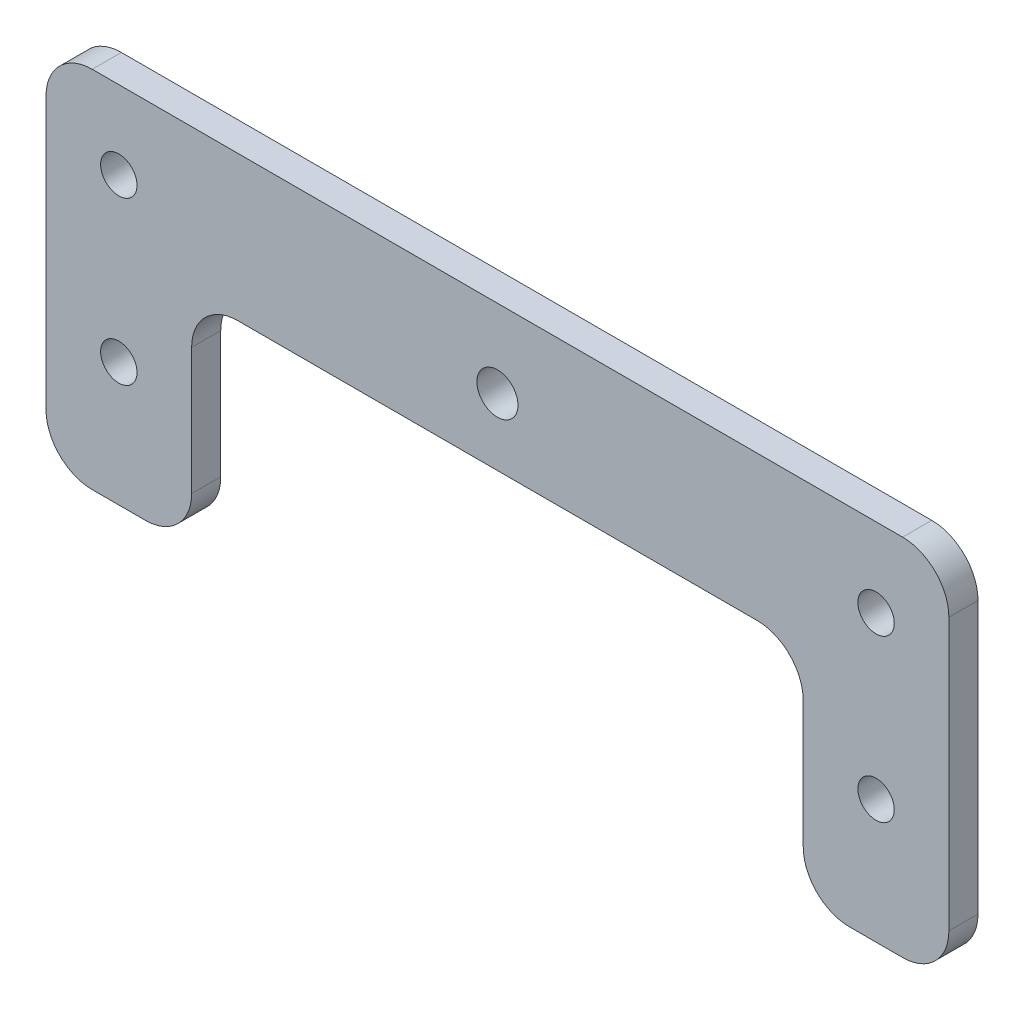
ISO-10303-21;
HEADER;
FILE_DESCRIPTION(('STEP AP214'),'2;1');
FILE_NAME('part.step','',(''),(''),'','','');
FILE_SCHEMA(('AUTOMOTIVE_DESIGN { 1 0 10303 214 1 1 1 1 }'));
ENDSEC;
DATA;
#1=APPLICATION_CONTEXT('core data for automotive mechanical design processes');
#2=APPLICATION_PROTOCOL_DEFINITION('international standard','automotive_design',2000,#1);
#3=PRODUCT_CONTEXT('',#1,'mechanical');
#4=PRODUCT('Part','Part','',(#3));
#5=PRODUCT_RELATED_PRODUCT_CATEGORY('part','',(#4));
#6=PRODUCT_DEFINITION_FORMATION('','',#4);
#7=PRODUCT_DEFINITION_CONTEXT('part definition',#1,'design');
#8=PRODUCT_DEFINITION('design','',#6,#7);
#9=PRODUCT_DEFINITION_SHAPE('','',#8);
#10=(LENGTH_UNIT() NAMED_UNIT(*) SI_UNIT(.MILLI.,.METRE.));
#11=(NAMED_UNIT(*) PLANE_ANGLE_UNIT() SI_UNIT($,.RADIAN.));
#12=(NAMED_UNIT(*) SI_UNIT($,.STERADIAN.) SOLID_ANGLE_UNIT());
#13=UNCERTAINTY_MEASURE_WITH_UNIT(LENGTH_MEASURE(1.E-05),#10,'distance_accuracy_value','');
#14=(GEOMETRIC_REPRESENTATION_CONTEXT(3) GLOBAL_UNCERTAINTY_ASSIGNED_CONTEXT((#13)) GLOBAL_UNIT_ASSIGNED_CONTEXT((#10,
#11,#12)) REPRESENTATION_CONTEXT('',''));
#15=CARTESIAN_POINT('',(0.,0.,0.));
#16=DIRECTION('',(0.,0.,1.));
#17=DIRECTION('',(1.,0.,0.));
#18=AXIS2_PLACEMENT_3D('',#15,#16,#17);
#19=CARTESIAN_POINT('',(0.,26.6043563241678,4.));
#20=DIRECTION('',(0.,1.,0.));
#21=DIRECTION('',(-1.,0.,0.));
#22=AXIS2_PLACEMENT_3D('',#19,#20,#21);
#23=PLANE('',#22);
#24=DIRECTION('',(1.,0.,0.));
#25=VECTOR('',#24,1.);
#26=CARTESIAN_POINT('',(0.,26.6043563241678,0.));
#27=LINE('',#26,#25);
#28=CARTESIAN_POINT('',(6.53805092256945,26.6043563241678,0.));
#29=VERTEX_POINT('',#28);
#30=CARTESIAN_POINT('',(117.838050922569,26.6043563241678,0.));
#31=VERTEX_POINT('',#30);
#32=EDGE_CURVE('E200',#29,#31,#27,.T.);
#33=ORIENTED_EDGE('',*,*,#32,.F.);
#34=DIRECTION('',(0.,0.,-1.));
#35=VECTOR('',#34,1.);
#36=CARTESIAN_POINT('',(6.53805092256945,26.6043563241678,4.));
#37=LINE('',#36,#35);
#38=CARTESIAN_POINT('',(6.53805092256945,26.6043563241678,4.));
#39=VERTEX_POINT('',#38);
#40=EDGE_CURVE('E11',#39,#29,#37,.T.);
#41=ORIENTED_EDGE('',*,*,#40,.F.);
#42=DIRECTION('',(1.,0.,0.));
#43=VECTOR('',#42,1.);
#44=CARTESIAN_POINT('',(0.,26.6043563241678,4.));
#45=LINE('',#44,#43);
#46=CARTESIAN_POINT('',(117.838050922569,26.6043563241678,4.));
#47=VERTEX_POINT('',#46);
#48=EDGE_CURVE('E300',#39,#47,#45,.T.);
#49=ORIENTED_EDGE('',*,*,#48,.T.);
#50=DIRECTION('',(0.,0.,-1.));
#51=VECTOR('',#50,1.);
#52=CARTESIAN_POINT('',(117.838050922569,26.6043563241678,4.));
#53=LINE('',#52,#51);
#54=EDGE_CURVE('E116',#47,#31,#53,.T.);
#55=ORIENTED_EDGE('',*,*,#54,.T.);
#56=EDGE_LOOP('',(#33,#41,#49,#55));
#57=FACE_BOUND('',#56,.T.);
#58=ADVANCED_FACE('F41',(#57),#23,.T.);
#59=CARTESIAN_POINT('',(6.53805092256941,20.2543563241678,4.));
#60=DIRECTION('',(0.,0.,-1.));
#61=DIRECTION('',(-1.,0.,0.));
#62=AXIS2_PLACEMENT_3D('',#59,#60,#61);
#63=CYLINDRICAL_SURFACE('',#62,6.35);
#64=CARTESIAN_POINT('',(6.53805092256941,20.2543563241678,0.));
#65=DIRECTION('',(0.,0.,1.));
#66=DIRECTION('',(1.,0.,0.));
#67=AXIS2_PLACEMENT_3D('',#64,#65,#66);
#68=CIRCLE('',#67,6.35);
#69=CARTESIAN_POINT('',(0.188050922569407,20.2543563241677,0.));
#70=VERTEX_POINT('',#69);
#71=EDGE_CURVE('E203',#29,#70,#68,.T.);
#72=ORIENTED_EDGE('',*,*,#71,.T.);
#73=DIRECTION('',(0.,0.,-1.));
#74=VECTOR('',#73,1.);
#75=CARTESIAN_POINT('',(0.188050922569407,20.2543563241677,4.));
#76=LINE('',#75,#74);
#77=CARTESIAN_POINT('',(0.188050922569407,20.2543563241677,4.));
#78=VERTEX_POINT('',#77);
#79=EDGE_CURVE('E50',#78,#70,#76,.T.);
#80=ORIENTED_EDGE('',*,*,#79,.F.);
#81=CARTESIAN_POINT('',(6.53805092256941,20.2543563241678,4.));
#82=DIRECTION('',(0.,0.,1.));
#83=DIRECTION('',(1.,0.,0.));
#84=AXIS2_PLACEMENT_3D('',#81,#82,#83);
#85=CIRCLE('',#84,6.35);
#86=EDGE_CURVE('E296',#39,#78,#85,.T.);
#87=ORIENTED_EDGE('',*,*,#86,.F.);
#88=ORIENTED_EDGE('',*,*,#40,.T.);
#89=EDGE_LOOP('',(#72,#80,#87,#88));
#90=FACE_BOUND('',#89,.T.);
#91=ADVANCED_FACE('F283',(#90),#63,.T.);
#92=CARTESIAN_POINT('',(0.188050922569409,0.,4.));
#93=DIRECTION('',(-1.,0.,0.));
#94=DIRECTION('',(0.,-1.,0.));
#95=AXIS2_PLACEMENT_3D('',#92,#93,#94);
#96=PLANE('',#95);
#97=DIRECTION('',(0.,1.,0.));
#98=VECTOR('',#97,1.);
#99=CARTESIAN_POINT('',(0.188050922569409,0.,0.));
#100=LINE('',#99,#98);
#101=CARTESIAN_POINT('',(0.188050922569411,-17.0456436758322,0.));
#102=VERTEX_POINT('',#101);
#103=EDGE_CURVE('E206',#102,#70,#100,.T.);
#104=ORIENTED_EDGE('',*,*,#103,.F.);
#105=DIRECTION('',(0.,0.,-1.));
#106=VECTOR('',#105,1.);
#107=CARTESIAN_POINT('',(0.188050922569411,-17.0456436758322,4.));
#108=LINE('',#107,#106);
#109=CARTESIAN_POINT('',(0.188050922569411,-17.0456436758322,4.));
#110=VERTEX_POINT('',#109);
#111=EDGE_CURVE('E273',#110,#102,#108,.T.);
#112=ORIENTED_EDGE('',*,*,#111,.F.);
#113=DIRECTION('',(0.,1.,0.));
#114=VECTOR('',#113,1.);
#115=CARTESIAN_POINT('',(0.188050922569409,0.,4.));
#116=LINE('',#115,#114);
#117=EDGE_CURVE('E280',#110,#78,#116,.T.);
#118=ORIENTED_EDGE('',*,*,#117,.T.);
#119=ORIENTED_EDGE('',*,*,#79,.T.);
#120=EDGE_LOOP('',(#104,#112,#118,#119));
#121=FACE_BOUND('',#120,.T.);
#122=ADVANCED_FACE('F278',(#121),#96,.T.);
#123=CARTESIAN_POINT('',(6.53805092256941,-17.0456436758322,4.));
#124=DIRECTION('',(0.,0.,-1.));
#125=DIRECTION('',(-1.,0.,0.));
#126=AXIS2_PLACEMENT_3D('',#123,#124,#125);
#127=CYLINDRICAL_SURFACE('',#126,6.35);
#128=CARTESIAN_POINT('',(6.53805092256941,-17.0456436758322,0.));
#129=DIRECTION('',(0.,0.,1.));
#130=DIRECTION('',(1.,0.,0.));
#131=AXIS2_PLACEMENT_3D('',#128,#129,#130);
#132=CIRCLE('',#131,6.35);
#133=CARTESIAN_POINT('',(6.53805092256945,-23.3956436758322,0.));
#134=VERTEX_POINT('',#133);
#135=EDGE_CURVE('E209',#134,#102,#132,.F.);
#136=ORIENTED_EDGE('',*,*,#135,.F.);
#137=DIRECTION('',(0.,0.,-1.));
#138=VECTOR('',#137,1.);
#139=CARTESIAN_POINT('',(6.53805092256945,-23.3956436758322,4.));
#140=LINE('',#139,#138);
#141=CARTESIAN_POINT('',(6.53805092256945,-23.3956436758322,4.));
#142=VERTEX_POINT('',#141);
#143=EDGE_CURVE('E271',#142,#134,#140,.T.);
#144=ORIENTED_EDGE('',*,*,#143,.F.);
#145=CARTESIAN_POINT('',(6.53805092256941,-17.0456436758322,4.));
#146=DIRECTION('',(0.,0.,1.));
#147=DIRECTION('',(1.,0.,0.));
#148=AXIS2_PLACEMENT_3D('',#145,#146,#147);
#149=CIRCLE('',#148,6.35);
#150=EDGE_CURVE('E294',#142,#110,#149,.F.);
#151=ORIENTED_EDGE('',*,*,#150,.T.);
#152=ORIENTED_EDGE('',*,*,#111,.T.);
#153=EDGE_LOOP('',(#136,#144,#151,#152));
#154=FACE_BOUND('',#153,.T.);
#155=ADVANCED_FACE('F290',(#154),#127,.T.);
#156=CARTESIAN_POINT('',(0.,-23.3956436758322,4.));
#157=DIRECTION('',(0.,1.,0.));
#158=DIRECTION('',(-1.,0.,0.));
#159=AXIS2_PLACEMENT_3D('',#156,#157,#158);
#160=PLANE('',#159);
#161=DIRECTION('',(1.,0.,0.));
#162=VECTOR('',#161,1.);
#163=CARTESIAN_POINT('',(0.,-23.3956436758322,0.));
#164=LINE('',#163,#162);
#165=CARTESIAN_POINT('',(13.8380509225694,-23.3956436758322,0.));
#166=VERTEX_POINT('',#165);
#167=EDGE_CURVE('E212',#134,#166,#164,.T.);
#168=ORIENTED_EDGE('',*,*,#167,.T.);
#169=DIRECTION('',(0.,0.,-1.));
#170=VECTOR('',#169,1.);
#171=CARTESIAN_POINT('',(13.8380509225694,-23.3956436758322,4.));
#172=LINE('',#171,#170);
#173=CARTESIAN_POINT('',(13.8380509225694,-23.3956436758322,4.));
#174=VERTEX_POINT('',#173);
#175=EDGE_CURVE('E268',#174,#166,#172,.T.);
#176=ORIENTED_EDGE('',*,*,#175,.F.);
#177=DIRECTION('',(1.,0.,0.));
#178=VECTOR('',#177,1.);
#179=CARTESIAN_POINT('',(0.,-23.3956436758322,4.));
#180=LINE('',#179,#178);
#181=EDGE_CURVE('E298',#142,#174,#180,.T.);
#182=ORIENTED_EDGE('',*,*,#181,.F.);
#183=ORIENTED_EDGE('',*,*,#143,.T.);
#184=EDGE_LOOP('',(#168,#176,#182,#183));
#185=FACE_BOUND('',#184,.T.);
#186=ADVANCED_FACE('F422',(#185),#160,.F.);
#187=CARTESIAN_POINT('',(13.8380509225694,-17.0456436758322,4.));
#188=DIRECTION('',(0.,0.,-1.));
#189=DIRECTION('',(-1.,0.,0.));
#190=AXIS2_PLACEMENT_3D('',#187,#188,#189);
#191=CYLINDRICAL_SURFACE('',#190,6.35);
#192=CARTESIAN_POINT('',(13.8380509225694,-17.0456436758322,0.));
#193=DIRECTION('',(0.,0.,1.));
#194=DIRECTION('',(1.,0.,0.));
#195=AXIS2_PLACEMENT_3D('',#192,#193,#194);
#196=CIRCLE('',#195,6.35);
#197=CARTESIAN_POINT('',(20.1880509225694,-17.0456436758322,0.));
#198=VERTEX_POINT('',#197);
#199=EDGE_CURVE('E215',#166,#198,#196,.T.);
#200=ORIENTED_EDGE('',*,*,#199,.T.);
#201=DIRECTION('',(0.,0.,-1.));
#202=VECTOR('',#201,1.);
#203=CARTESIAN_POINT('',(20.1880509225694,-17.0456436758322,4.));
#204=LINE('',#203,#202);
#205=CARTESIAN_POINT('',(20.1880509225694,-17.0456436758322,4.));
#206=VERTEX_POINT('',#205);
#207=EDGE_CURVE('E266',#206,#198,#204,.T.);
#208=ORIENTED_EDGE('',*,*,#207,.F.);
#209=CARTESIAN_POINT('',(13.8380509225694,-17.0456436758322,4.));
#210=DIRECTION('',(0.,0.,1.));
#211=DIRECTION('',(1.,0.,0.));
#212=AXIS2_PLACEMENT_3D('',#209,#210,#211);
#213=CIRCLE('',#212,6.35);
#214=EDGE_CURVE('E305',#174,#206,#213,.T.);
#215=ORIENTED_EDGE('',*,*,#214,.F.);
#216=ORIENTED_EDGE('',*,*,#175,.T.);
#217=EDGE_LOOP('',(#200,#208,#215,#216));
#218=FACE_BOUND('',#217,.T.);
#219=ADVANCED_FACE('F418',(#218),#191,.T.);
#220=CARTESIAN_POINT('',(20.1880509225694,0.,4.));
#221=DIRECTION('',(1.,0.,0.));
#222=DIRECTION('',(0.,1.,0.));
#223=AXIS2_PLACEMENT_3D('',#220,#221,#222);
#224=PLANE('',#223);
#225=DIRECTION('',(0.,-1.,0.));
#226=VECTOR('',#225,1.);
#227=CARTESIAN_POINT('',(20.1880509225694,0.,0.));
#228=LINE('',#227,#226);
#229=CARTESIAN_POINT('',(20.1880509225694,0.349416953919576,0.));
#230=VERTEX_POINT('',#229);
#231=EDGE_CURVE('E218',#230,#198,#228,.T.);
#232=ORIENTED_EDGE('',*,*,#231,.F.);
#233=DIRECTION('',(0.,0.,-1.));
#234=VECTOR('',#233,1.);
#235=CARTESIAN_POINT('',(20.1880509225694,0.349416953919576,4.));
#236=LINE('',#235,#234);
#237=CARTESIAN_POINT('',(20.1880509225694,0.349416953919576,4.));
#238=VERTEX_POINT('',#237);
#239=EDGE_CURVE('E264',#238,#230,#236,.T.);
#240=ORIENTED_EDGE('',*,*,#239,.F.);
#241=DIRECTION('',(0.,-1.,0.));
#242=VECTOR('',#241,1.);
#243=CARTESIAN_POINT('',(20.1880509225694,0.,4.));
#244=LINE('',#243,#242);
#245=EDGE_CURVE('E307',#238,#206,#244,.T.);
#246=ORIENTED_EDGE('',*,*,#245,.T.);
#247=ORIENTED_EDGE('',*,*,#207,.T.);
#248=EDGE_LOOP('',(#232,#240,#246,#247));
#249=FACE_BOUND('',#248,.T.);
#250=ADVANCED_FACE('F414',(#249),#224,.T.);
#251=CARTESIAN_POINT('',(26.5380509225694,0.349416953919623,4.));
#252=DIRECTION('',(0.,0.,-1.));
#253=DIRECTION('',(-1.,0.,0.));
#254=AXIS2_PLACEMENT_3D('',#251,#252,#253);
#255=CYLINDRICAL_SURFACE('',#254,6.35);
#256=CARTESIAN_POINT('',(26.5380509225694,0.349416953919623,0.));
#257=DIRECTION('',(0.,0.,1.));
#258=DIRECTION('',(1.,0.,0.));
#259=AXIS2_PLACEMENT_3D('',#256,#257,#258);
#260=CIRCLE('',#259,6.35);
#261=CARTESIAN_POINT('',(26.5380509225695,6.69941695391962,0.));
#262=VERTEX_POINT('',#261);
#263=EDGE_CURVE('E221',#262,#230,#260,.T.);
#264=ORIENTED_EDGE('',*,*,#263,.F.);
#265=DIRECTION('',(0.,0.,-1.));
#266=VECTOR('',#265,1.);
#267=CARTESIAN_POINT('',(26.5380509225695,6.69941695391962,4.));
#268=LINE('',#267,#266);
#269=CARTESIAN_POINT('',(26.5380509225695,6.69941695391962,4.));
#270=VERTEX_POINT('',#269);
#271=EDGE_CURVE('E262',#270,#262,#268,.T.);
#272=ORIENTED_EDGE('',*,*,#271,.F.);
#273=CARTESIAN_POINT('',(26.5380509225694,0.349416953919623,4.));
#274=DIRECTION('',(0.,0.,1.));
#275=DIRECTION('',(1.,0.,0.));
#276=AXIS2_PLACEMENT_3D('',#273,#274,#275);
#277=CIRCLE('',#276,6.35);
#278=EDGE_CURVE('E310',#270,#238,#277,.T.);
#279=ORIENTED_EDGE('',*,*,#278,.T.);
#280=ORIENTED_EDGE('',*,*,#239,.T.);
#281=EDGE_LOOP('',(#264,#272,#279,#280));
#282=FACE_BOUND('',#281,.T.);
#283=ADVANCED_FACE('F410',(#282),#255,.F.);
#284=CARTESIAN_POINT('',(0.,6.69941695391962,4.));
#285=DIRECTION('',(0.,1.,0.));
#286=DIRECTION('',(-1.,0.,0.));
#287=AXIS2_PLACEMENT_3D('',#284,#285,#286);
#288=PLANE('',#287);
#289=DIRECTION('',(1.,0.,0.));
#290=VECTOR('',#289,1.);
#291=CARTESIAN_POINT('',(0.,6.69941695391962,0.));
#292=LINE('',#291,#290);
#293=CARTESIAN_POINT('',(97.8380509225694,6.69941695391962,0.));
#294=VERTEX_POINT('',#293);
#295=EDGE_CURVE('E224',#262,#294,#292,.T.);
#296=ORIENTED_EDGE('',*,*,#295,.T.);
#297=DIRECTION('',(0.,0.,-1.));
#298=VECTOR('',#297,1.);
#299=CARTESIAN_POINT('',(97.8380509225694,6.69941695391962,4.));
#300=LINE('',#299,#298);
#301=CARTESIAN_POINT('',(97.8380509225694,6.69941695391962,4.));
#302=VERTEX_POINT('',#301);
#303=EDGE_CURVE('E260',#302,#294,#300,.T.);
#304=ORIENTED_EDGE('',*,*,#303,.F.);
#305=DIRECTION('',(1.,0.,0.));
#306=VECTOR('',#305,1.);
#307=CARTESIAN_POINT('',(0.,6.69941695391962,4.));
#308=LINE('',#307,#306);
#309=EDGE_CURVE('E313',#270,#302,#308,.T.);
#310=ORIENTED_EDGE('',*,*,#309,.F.);
#311=ORIENTED_EDGE('',*,*,#271,.T.);
#312=EDGE_LOOP('',(#296,#304,#310,#311));
#313=FACE_BOUND('',#312,.T.);
#314=ADVANCED_FACE('F406',(#313),#288,.F.);
#315=CARTESIAN_POINT('',(97.8380509225694,0.349416953919623,4.));
#316=DIRECTION('',(0.,0.,-1.));
#317=DIRECTION('',(-1.,0.,0.));
#318=AXIS2_PLACEMENT_3D('',#315,#316,#317);
#319=CYLINDRICAL_SURFACE('',#318,6.35);
#320=CARTESIAN_POINT('',(97.8380509225694,0.349416953919623,0.));
#321=DIRECTION('',(0.,0.,1.));
#322=DIRECTION('',(1.,0.,0.));
#323=AXIS2_PLACEMENT_3D('',#320,#321,#322);
#324=CIRCLE('',#323,6.35);
#325=CARTESIAN_POINT('',(104.188050922569,0.349416953919632,0.));
#326=VERTEX_POINT('',#325);
#327=EDGE_CURVE('E227',#326,#294,#324,.T.);
#328=ORIENTED_EDGE('',*,*,#327,.F.);
#329=DIRECTION('',(0.,0.,-1.));
#330=VECTOR('',#329,1.);
#331=CARTESIAN_POINT('',(104.188050922569,0.349416953919632,4.));
#332=LINE('',#331,#330);
#333=CARTESIAN_POINT('',(104.188050922569,0.349416953919632,4.));
#334=VERTEX_POINT('',#333);
#335=EDGE_CURVE('E258',#334,#326,#332,.T.);
#336=ORIENTED_EDGE('',*,*,#335,.F.);
#337=CARTESIAN_POINT('',(97.8380509225694,0.349416953919623,4.));
#338=DIRECTION('',(0.,0.,1.));
#339=DIRECTION('',(1.,0.,0.));
#340=AXIS2_PLACEMENT_3D('',#337,#338,#339);
#341=CIRCLE('',#340,6.35);
#342=EDGE_CURVE('E315',#334,#302,#341,.T.);
#343=ORIENTED_EDGE('',*,*,#342,.T.);
#344=ORIENTED_EDGE('',*,*,#303,.T.);
#345=EDGE_LOOP('',(#328,#336,#343,#344));
#346=FACE_BOUND('',#345,.T.);
#347=ADVANCED_FACE('F402',(#346),#319,.F.);
#348=CARTESIAN_POINT('',(104.188050922569,0.,4.));
#349=DIRECTION('',(1.,0.,0.));
#350=DIRECTION('',(0.,1.,0.));
#351=AXIS2_PLACEMENT_3D('',#348,#349,#350);
#352=PLANE('',#351);
#353=DIRECTION('',(0.,-1.,0.));
#354=VECTOR('',#353,1.);
#355=CARTESIAN_POINT('',(104.188050922569,0.,0.));
#356=LINE('',#355,#354);
#357=CARTESIAN_POINT('',(104.188050922569,-17.0456436758322,0.));
#358=VERTEX_POINT('',#357);
#359=EDGE_CURVE('E230',#326,#358,#356,.T.);
#360=ORIENTED_EDGE('',*,*,#359,.T.);
#361=DIRECTION('',(0.,0.,-1.));
#362=VECTOR('',#361,1.);
#363=CARTESIAN_POINT('',(104.188050922569,-17.0456436758322,4.));
#364=LINE('',#363,#362);
#365=CARTESIAN_POINT('',(104.188050922569,-17.0456436758322,4.));
#366=VERTEX_POINT('',#365);
#367=EDGE_CURVE('E256',#366,#358,#364,.T.);
#368=ORIENTED_EDGE('',*,*,#367,.F.);
#369=DIRECTION('',(0.,-1.,0.));
#370=VECTOR('',#369,1.);
#371=CARTESIAN_POINT('',(104.188050922569,0.,4.));
#372=LINE('',#371,#370);
#373=EDGE_CURVE('E318',#334,#366,#372,.T.);
#374=ORIENTED_EDGE('',*,*,#373,.F.);
#375=ORIENTED_EDGE('',*,*,#335,.T.);
#376=EDGE_LOOP('',(#360,#368,#374,#375));
#377=FACE_BOUND('',#376,.T.);
#378=ADVANCED_FACE('F398',(#377),#352,.F.);
#379=CARTESIAN_POINT('',(110.538050922569,-17.0456436758322,4.));
#380=DIRECTION('',(0.,0.,-1.));
#381=DIRECTION('',(-1.,0.,0.));
#382=AXIS2_PLACEMENT_3D('',#379,#380,#381);
#383=CYLINDRICAL_SURFACE('',#382,6.35);
#384=CARTESIAN_POINT('',(110.538050922569,-17.0456436758322,0.));
#385=DIRECTION('',(0.,0.,1.));
#386=DIRECTION('',(1.,0.,0.));
#387=AXIS2_PLACEMENT_3D('',#384,#385,#386);
#388=CIRCLE('',#387,6.35);
#389=CARTESIAN_POINT('',(110.538050922569,-23.3956436758322,0.));
#390=VERTEX_POINT('',#389);
#391=EDGE_CURVE('E233',#390,#358,#388,.F.);
#392=ORIENTED_EDGE('',*,*,#391,.F.);
#393=DIRECTION('',(0.,0.,-1.));
#394=VECTOR('',#393,1.);
#395=CARTESIAN_POINT('',(110.538050922569,-23.3956436758322,4.));
#396=LINE('',#395,#394);
#397=CARTESIAN_POINT('',(110.538050922569,-23.3956436758322,4.));
#398=VERTEX_POINT('',#397);
#399=EDGE_CURVE('E254',#398,#390,#396,.T.);
#400=ORIENTED_EDGE('',*,*,#399,.F.);
#401=CARTESIAN_POINT('',(110.538050922569,-17.0456436758322,4.));
#402=DIRECTION('',(0.,0.,1.));
#403=DIRECTION('',(1.,0.,0.));
#404=AXIS2_PLACEMENT_3D('',#401,#402,#403);
#405=CIRCLE('',#404,6.35);
#406=EDGE_CURVE('E320',#398,#366,#405,.F.);
#407=ORIENTED_EDGE('',*,*,#406,.T.);
#408=ORIENTED_EDGE('',*,*,#367,.T.);
#409=EDGE_LOOP('',(#392,#400,#407,#408));
#410=FACE_BOUND('',#409,.T.);
#411=ADVANCED_FACE('F395',(#410),#383,.T.);
#412=CARTESIAN_POINT('',(0.,-23.3956436758323,4.));
#413=DIRECTION('',(0.,-1.,0.));
#414=DIRECTION('',(1.,0.,0.));
#415=AXIS2_PLACEMENT_3D('',#412,#413,#414);
#416=PLANE('',#415);
#417=DIRECTION('',(-1.,0.,0.));
#418=VECTOR('',#417,1.);
#419=CARTESIAN_POINT('',(0.,-23.3956436758323,0.));
#420=LINE('',#419,#418);
#421=CARTESIAN_POINT('',(117.838050922569,-23.3956436758322,0.));
#422=VERTEX_POINT('',#421);
#423=EDGE_CURVE('E236',#422,#390,#420,.T.);
#424=ORIENTED_EDGE('',*,*,#423,.F.);
#425=DIRECTION('',(0.,0.,-1.));
#426=VECTOR('',#425,1.);
#427=CARTESIAN_POINT('',(117.838050922569,-23.3956436758322,4.));
#428=LINE('',#427,#426);
#429=CARTESIAN_POINT('',(117.838050922569,-23.3956436758322,4.));
#430=VERTEX_POINT('',#429);
#431=EDGE_CURVE('E178',#430,#422,#428,.T.);
#432=ORIENTED_EDGE('',*,*,#431,.F.);
#433=DIRECTION('',(-1.,0.,0.));
#434=VECTOR('',#433,1.);
#435=CARTESIAN_POINT('',(0.,-23.3956436758323,4.));
#436=LINE('',#435,#434);
#437=EDGE_CURVE('E167',#430,#398,#436,.T.);
#438=ORIENTED_EDGE('',*,*,#437,.T.);
#439=ORIENTED_EDGE('',*,*,#399,.T.);
#440=EDGE_LOOP('',(#424,#432,#438,#439));
#441=FACE_BOUND('',#440,.T.);
#442=ADVANCED_FACE('F324',(#441),#416,.T.);
#443=CARTESIAN_POINT('',(117.838050922569,-17.0456436758322,4.));
#444=DIRECTION('',(0.,0.,-1.));
#445=DIRECTION('',(-1.,0.,0.));
#446=AXIS2_PLACEMENT_3D('',#443,#444,#445);
#447=CYLINDRICAL_SURFACE('',#446,6.35);
#448=CARTESIAN_POINT('',(117.838050922569,-17.0456436758322,0.));
#449=DIRECTION('',(0.,0.,1.));
#450=DIRECTION('',(1.,0.,0.));
#451=AXIS2_PLACEMENT_3D('',#448,#449,#450);
#452=CIRCLE('',#451,6.35);
#453=CARTESIAN_POINT('',(124.188050922569,-17.0456436758322,0.));
#454=VERTEX_POINT('',#453);
#455=EDGE_CURVE('E174',#422,#454,#452,.T.);
#456=ORIENTED_EDGE('',*,*,#455,.T.);
#457=DIRECTION('',(0.,0.,-1.));
#458=VECTOR('',#457,1.);
#459=CARTESIAN_POINT('',(124.188050922569,-17.0456436758322,4.));
#460=LINE('',#459,#458);
#461=CARTESIAN_POINT('',(124.188050922569,-17.0456436758322,4.));
#462=VERTEX_POINT('',#461);
#463=EDGE_CURVE('E171',#462,#454,#460,.T.);
#464=ORIENTED_EDGE('',*,*,#463,.F.);
#465=CARTESIAN_POINT('',(117.838050922569,-17.0456436758322,4.));
#466=DIRECTION('',(0.,0.,1.));
#467=DIRECTION('',(1.,0.,0.));
#468=AXIS2_PLACEMENT_3D('',#465,#466,#467);
#469=CIRCLE('',#468,6.35);
#470=EDGE_CURVE('E159',#430,#462,#469,.T.);
#471=ORIENTED_EDGE('',*,*,#470,.F.);
#472=ORIENTED_EDGE('',*,*,#431,.T.);
#473=EDGE_LOOP('',(#456,#464,#471,#472));
#474=FACE_BOUND('',#473,.T.);
#475=ADVANCED_FACE('F172',(#474),#447,.T.);
#476=CARTESIAN_POINT('',(124.188050922569,0.,4.));
#477=DIRECTION('',(1.,0.,0.));
#478=DIRECTION('',(0.,0.,-1.));
#479=AXIS2_PLACEMENT_3D('',#476,#477,#478);
#480=PLANE('',#479);
#481=DIRECTION('',(0.,-1.,0.));
#482=VECTOR('',#481,1.);
#483=CARTESIAN_POINT('',(124.188050922569,0.,0.));
#484=LINE('',#483,#482);
#485=CARTESIAN_POINT('',(124.188050922569,20.2543563241678,0.));
#486=VERTEX_POINT('',#485);
#487=EDGE_CURVE('E240',#486,#454,#484,.T.);
#488=ORIENTED_EDGE('',*,*,#487,.F.);
#489=DIRECTION('',(0.,0.,-1.));
#490=VECTOR('',#489,1.);
#491=CARTESIAN_POINT('',(124.188050922569,20.2543563241678,4.));
#492=LINE('',#491,#490);
#493=CARTESIAN_POINT('',(124.188050922569,20.2543563241678,4.));
#494=VERTEX_POINT('',#493);
#495=EDGE_CURVE('E109',#494,#486,#492,.T.);
#496=ORIENTED_EDGE('',*,*,#495,.F.);
#497=DIRECTION('',(0.,-1.,0.));
#498=VECTOR('',#497,1.);
#499=CARTESIAN_POINT('',(124.188050922569,0.,4.));
#500=LINE('',#499,#498);
#501=EDGE_CURVE('E164',#494,#462,#500,.T.);
#502=ORIENTED_EDGE('',*,*,#501,.T.);
#503=ORIENTED_EDGE('',*,*,#463,.T.);
#504=EDGE_LOOP('',(#488,#496,#502,#503));
#505=FACE_BOUND('',#504,.T.);
#506=ADVANCED_FACE('F180',(#505),#480,.T.);
#507=CARTESIAN_POINT('',(10.1880509225694,15.8664983327679,4.));
#508=DIRECTION('',(0.,0.,-1.));
#509=DIRECTION('',(-1.,0.,0.));
#510=AXIS2_PLACEMENT_3D('',#507,#508,#509);
#511=CYLINDRICAL_SURFACE('',#510,2.5);
#512=CARTESIAN_POINT('',(10.1880509225694,15.8664983327679,4.));
#513=DIRECTION('',(0.,0.,1.));
#514=DIRECTION('',(1.,0.,0.));
#515=AXIS2_PLACEMENT_3D('',#512,#513,#514);
#516=CIRCLE('',#515,2.5);
#517=CARTESIAN_POINT('',(12.6880509225694,15.8664983327679,4.));
#518=VERTEX_POINT('',#517);
#519=EDGE_CURVE('E182',#518,#518,#516,.T.);
#520=ORIENTED_EDGE('',*,*,#519,.T.);
#521=EDGE_LOOP('',(#520));
#522=FACE_BOUND('',#521,.T.);
#523=CARTESIAN_POINT('',(10.1880509225694,15.8664983327679,0.));
#524=DIRECTION('',(0.,0.,1.));
#525=DIRECTION('',(1.,0.,0.));
#526=AXIS2_PLACEMENT_3D('',#523,#524,#525);
#527=CIRCLE('',#526,2.5);
#528=CARTESIAN_POINT('',(12.6880509225694,15.8664983327679,0.));
#529=VERTEX_POINT('',#528);
#530=EDGE_CURVE('E244',#529,#529,#527,.T.);
#531=ORIENTED_EDGE('',*,*,#530,.F.);
#532=EDGE_LOOP('',(#531));
#533=FACE_BOUND('',#532,.T.);
#534=ADVANCED_FACE('F383',(#522,#533),#511,.F.);
#535=CARTESIAN_POINT('',(117.838050922569,20.2543563241678,4.));
#536=DIRECTION('',(0.,0.,-1.));
#537=DIRECTION('',(-1.,0.,0.));
#538=AXIS2_PLACEMENT_3D('',#535,#536,#537);
#539=CYLINDRICAL_SURFACE('',#538,6.35);
#540=CARTESIAN_POINT('',(117.838050922569,20.2543563241678,0.));
#541=DIRECTION('',(0.,0.,1.));
#542=DIRECTION('',(1.,0.,0.));
#543=AXIS2_PLACEMENT_3D('',#540,#541,#542);
#544=CIRCLE('',#543,6.35);
#545=EDGE_CURVE('E242',#486,#31,#544,.T.);
#546=ORIENTED_EDGE('',*,*,#545,.T.);
#547=ORIENTED_EDGE('',*,*,#54,.F.);
#548=CARTESIAN_POINT('',(117.838050922569,20.2543563241678,4.));
#549=DIRECTION('',(0.,0.,1.));
#550=DIRECTION('',(1.,0.,0.));
#551=AXIS2_PLACEMENT_3D('',#548,#549,#550);
#552=CIRCLE('',#551,6.35);
#553=EDGE_CURVE('E58',#494,#47,#552,.T.);
#554=ORIENTED_EDGE('',*,*,#553,.F.);
#555=ORIENTED_EDGE('',*,*,#495,.T.);
#556=EDGE_LOOP('',(#546,#547,#554,#555));
#557=FACE_BOUND('',#556,.T.);
#558=ADVANCED_FACE('F326',(#557),#539,.T.);
#559=CARTESIAN_POINT('',(114.188050922569,15.771437703016,4.));
#560=DIRECTION('',(0.,0.,-1.));
#561=DIRECTION('',(-1.,0.,0.));
#562=AXIS2_PLACEMENT_3D('',#559,#560,#561);
#563=CYLINDRICAL_SURFACE('',#562,2.5);
#564=CARTESIAN_POINT('',(114.188050922569,15.771437703016,4.));
#565=DIRECTION('',(0.,0.,1.));
#566=DIRECTION('',(1.,0.,0.));
#567=AXIS2_PLACEMENT_3D('',#564,#565,#566);
#568=CIRCLE('',#567,2.5);
#569=CARTESIAN_POINT('',(116.688050922569,15.771437703016,4.));
#570=VERTEX_POINT('',#569);
#571=EDGE_CURVE('E327',#570,#570,#568,.T.);
#572=ORIENTED_EDGE('',*,*,#571,.T.);
#573=EDGE_LOOP('',(#572));
#574=FACE_BOUND('',#573,.T.);
#575=CARTESIAN_POINT('',(114.188050922569,15.771437703016,0.));
#576=DIRECTION('',(0.,0.,1.));
#577=DIRECTION('',(1.,0.,0.));
#578=AXIS2_PLACEMENT_3D('',#575,#576,#577);
#579=CIRCLE('',#578,2.5);
#580=CARTESIAN_POINT('',(116.688050922569,15.771437703016,0.));
#581=VERTEX_POINT('',#580);
#582=EDGE_CURVE('E197',#581,#581,#579,.T.);
#583=ORIENTED_EDGE('',*,*,#582,.F.);
#584=EDGE_LOOP('',(#583));
#585=FACE_BOUND('',#584,.T.);
#586=ADVANCED_FACE('F347',(#574,#585),#563,.F.);
#587=CARTESIAN_POINT('',(114.188050922569,-6.39564367583222,4.));
#588=DIRECTION('',(0.,0.,-1.));
#589=DIRECTION('',(-1.,0.,0.));
#590=AXIS2_PLACEMENT_3D('',#587,#588,#589);
#591=CYLINDRICAL_SURFACE('',#590,2.5);
#592=CARTESIAN_POINT('',(114.188050922569,-6.39564367583222,4.));
#593=DIRECTION('',(0.,0.,1.));
#594=DIRECTION('',(1.,0.,0.));
#595=AXIS2_PLACEMENT_3D('',#592,#593,#594);
#596=CIRCLE('',#595,2.5);
#597=CARTESIAN_POINT('',(116.688050922569,-6.39564367583222,4.));
#598=VERTEX_POINT('',#597);
#599=EDGE_CURVE('E329',#598,#598,#596,.F.);
#600=ORIENTED_EDGE('',*,*,#599,.F.);
#601=EDGE_LOOP('',(#600));
#602=FACE_BOUND('',#601,.T.);
#603=CARTESIAN_POINT('',(114.188050922569,-6.39564367583222,0.));
#604=DIRECTION('',(0.,0.,1.));
#605=DIRECTION('',(1.,0.,0.));
#606=AXIS2_PLACEMENT_3D('',#603,#604,#605);
#607=CIRCLE('',#606,2.5);
#608=CARTESIAN_POINT('',(116.688050922569,-6.39564367583222,0.));
#609=VERTEX_POINT('',#608);
#610=EDGE_CURVE('E194',#609,#609,#607,.F.);
#611=ORIENTED_EDGE('',*,*,#610,.T.);
#612=EDGE_LOOP('',(#611));
#613=FACE_BOUND('',#612,.T.);
#614=ADVANCED_FACE('F350',(#602,#613),#591,.F.);
#615=CARTESIAN_POINT('',(62.1880509225694,15.8664983327679,4.));
#616=DIRECTION('',(0.,0.,-1.));
#617=DIRECTION('',(-1.,0.,0.));
#618=AXIS2_PLACEMENT_3D('',#615,#616,#617);
#619=CYLINDRICAL_SURFACE('',#618,2.8213685039973);
#620=CARTESIAN_POINT('',(62.1880509225694,15.8664983327679,4.));
#621=DIRECTION('',(0.,0.,1.));
#622=DIRECTION('',(1.,0.,0.));
#623=AXIS2_PLACEMENT_3D('',#620,#621,#622);
#624=CIRCLE('',#623,2.8213685039973);
#625=CARTESIAN_POINT('',(65.0094194265667,15.8664983327679,4.));
#626=VERTEX_POINT('',#625);
#627=EDGE_CURVE('E250',#626,#626,#624,.T.);
#628=ORIENTED_EDGE('',*,*,#627,.T.);
#629=EDGE_LOOP('',(#628));
#630=FACE_BOUND('',#629,.T.);
#631=CARTESIAN_POINT('',(62.1880509225694,15.8664983327679,0.));
#632=DIRECTION('',(0.,0.,1.));
#633=DIRECTION('',(1.,0.,0.));
#634=AXIS2_PLACEMENT_3D('',#631,#632,#633);
#635=CIRCLE('',#634,2.8213685039973);
#636=CARTESIAN_POINT('',(65.0094194265667,15.8664983327679,0.));
#637=VERTEX_POINT('',#636);
#638=EDGE_CURVE('E191',#637,#637,#635,.T.);
#639=ORIENTED_EDGE('',*,*,#638,.F.);
#640=EDGE_LOOP('',(#639));
#641=FACE_BOUND('',#640,.T.);
#642=ADVANCED_FACE('F43',(#630,#641),#619,.F.);
#643=CARTESIAN_POINT('',(10.1880509225694,-6.39564367583224,4.));
#644=DIRECTION('',(0.,0.,-1.));
#645=DIRECTION('',(-1.,0.,0.));
#646=AXIS2_PLACEMENT_3D('',#643,#644,#645);
#647=CYLINDRICAL_SURFACE('',#646,2.5);
#648=CARTESIAN_POINT('',(10.1880509225694,-6.39564367583224,4.));
#649=DIRECTION('',(0.,0.,1.));
#650=DIRECTION('',(1.,0.,0.));
#651=AXIS2_PLACEMENT_3D('',#648,#649,#650);
#652=CIRCLE('',#651,2.5);
#653=CARTESIAN_POINT('',(12.6880509225694,-6.39564367583224,4.));
#654=VERTEX_POINT('',#653);
#655=EDGE_CURVE('E188',#654,#654,#652,.T.);
#656=ORIENTED_EDGE('',*,*,#655,.T.);
#657=EDGE_LOOP('',(#656));
#658=FACE_BOUND('',#657,.T.);
#659=CARTESIAN_POINT('',(10.1880509225694,-6.39564367583224,0.));
#660=DIRECTION('',(0.,0.,1.));
#661=DIRECTION('',(1.,0.,0.));
#662=AXIS2_PLACEMENT_3D('',#659,#660,#661);
#663=CIRCLE('',#662,2.5);
#664=CARTESIAN_POINT('',(12.6880509225694,-6.39564367583224,0.));
#665=VERTEX_POINT('',#664);
#666=EDGE_CURVE('E247',#665,#665,#663,.T.);
#667=ORIENTED_EDGE('',*,*,#666,.F.);
#668=EDGE_LOOP('',(#667));
#669=FACE_BOUND('',#668,.T.);
#670=ADVANCED_FACE('F341',(#658,#669),#647,.F.);
#671=CARTESIAN_POINT('',(0.,0.,4.));
#672=DIRECTION('',(0.,0.,1.));
#673=DIRECTION('',(1.,0.,0.));
#674=AXIS2_PLACEMENT_3D('',#671,#672,#673);
#675=PLANE('',#674);
#676=ORIENTED_EDGE('',*,*,#627,.F.);
#677=EDGE_LOOP('',(#676));
#678=FACE_BOUND('',#677,.T.);
#679=ORIENTED_EDGE('',*,*,#599,.T.);
#680=EDGE_LOOP('',(#679));
#681=FACE_BOUND('',#680,.T.);
#682=ORIENTED_EDGE('',*,*,#571,.F.);
#683=EDGE_LOOP('',(#682));
#684=FACE_BOUND('',#683,.T.);
#685=ORIENTED_EDGE('',*,*,#48,.F.);
#686=ORIENTED_EDGE('',*,*,#86,.T.);
#687=ORIENTED_EDGE('',*,*,#117,.F.);
#688=ORIENTED_EDGE('',*,*,#150,.F.);
#689=ORIENTED_EDGE('',*,*,#181,.T.);
#690=ORIENTED_EDGE('',*,*,#214,.T.);
#691=ORIENTED_EDGE('',*,*,#245,.F.);
#692=ORIENTED_EDGE('',*,*,#278,.F.);
#693=ORIENTED_EDGE('',*,*,#309,.T.);
#694=ORIENTED_EDGE('',*,*,#342,.F.);
#695=ORIENTED_EDGE('',*,*,#373,.T.);
#696=ORIENTED_EDGE('',*,*,#406,.F.);
#697=ORIENTED_EDGE('',*,*,#437,.F.);
#698=ORIENTED_EDGE('',*,*,#470,.T.);
#699=ORIENTED_EDGE('',*,*,#501,.F.);
#700=ORIENTED_EDGE('',*,*,#553,.T.);
#701=EDGE_LOOP('',(#685,#686,#687,#688,#689,#690,#691,#692,#693,#694,#695,#696,#697,#698,#699,#700));
#702=FACE_BOUND('',#701,.T.);
#703=ORIENTED_EDGE('',*,*,#519,.F.);
#704=EDGE_LOOP('',(#703));
#705=FACE_BOUND('',#704,.T.);
#706=ORIENTED_EDGE('',*,*,#655,.F.);
#707=EDGE_LOOP('',(#706));
#708=FACE_BOUND('',#707,.T.);
#709=ADVANCED_FACE('F161',(#678,#681,#684,#702,#705,#708),#675,.T.);
#710=CARTESIAN_POINT('',(0.,0.,0.));
#711=DIRECTION('',(0.,0.,1.));
#712=DIRECTION('',(1.,0.,0.));
#713=AXIS2_PLACEMENT_3D('',#710,#711,#712);
#714=PLANE('',#713);
#715=ORIENTED_EDGE('',*,*,#638,.T.);
#716=EDGE_LOOP('',(#715));
#717=FACE_BOUND('',#716,.T.);
#718=ORIENTED_EDGE('',*,*,#610,.F.);
#719=EDGE_LOOP('',(#718));
#720=FACE_BOUND('',#719,.T.);
#721=ORIENTED_EDGE('',*,*,#582,.T.);
#722=EDGE_LOOP('',(#721));
#723=FACE_BOUND('',#722,.T.);
#724=ORIENTED_EDGE('',*,*,#32,.T.);
#725=ORIENTED_EDGE('',*,*,#545,.F.);
#726=ORIENTED_EDGE('',*,*,#487,.T.);
#727=ORIENTED_EDGE('',*,*,#455,.F.);
#728=ORIENTED_EDGE('',*,*,#423,.T.);
#729=ORIENTED_EDGE('',*,*,#391,.T.);
#730=ORIENTED_EDGE('',*,*,#359,.F.);
#731=ORIENTED_EDGE('',*,*,#327,.T.);
#732=ORIENTED_EDGE('',*,*,#295,.F.);
#733=ORIENTED_EDGE('',*,*,#263,.T.);
#734=ORIENTED_EDGE('',*,*,#231,.T.);
#735=ORIENTED_EDGE('',*,*,#199,.F.);
#736=ORIENTED_EDGE('',*,*,#167,.F.);
#737=ORIENTED_EDGE('',*,*,#135,.T.);
#738=ORIENTED_EDGE('',*,*,#103,.T.);
#739=ORIENTED_EDGE('',*,*,#71,.F.);
#740=EDGE_LOOP('',(#724,#725,#726,#727,#728,#729,#730,#731,#732,#733,#734,#735,#736,#737,#738,#739));
#741=FACE_BOUND('',#740,.T.);
#742=ORIENTED_EDGE('',*,*,#530,.T.);
#743=EDGE_LOOP('',(#742));
#744=FACE_BOUND('',#743,.T.);
#745=ORIENTED_EDGE('',*,*,#666,.T.);
#746=EDGE_LOOP('',(#745));
#747=FACE_BOUND('',#746,.T.);
#748=ADVANCED_FACE('F285',(#717,#720,#723,#741,#744,#747),#714,.F.);
#749=CLOSED_SHELL('',(#58,#91,#122,#155,#186,#219,#250,#283,#314,#347,#378,#411,#442,#475,#506,
#534,#558,#586,#614,#642,#670,#709,#748));
#750=MANIFOLD_SOLID_BREP('B2',#749);
#751=ADVANCED_BREP_SHAPE_REPRESENTATION('',(#18,#750),#14);
#752=SHAPE_DEFINITION_REPRESENTATION(#9,#751);
ENDSEC;
END-ISO-10303-21;
